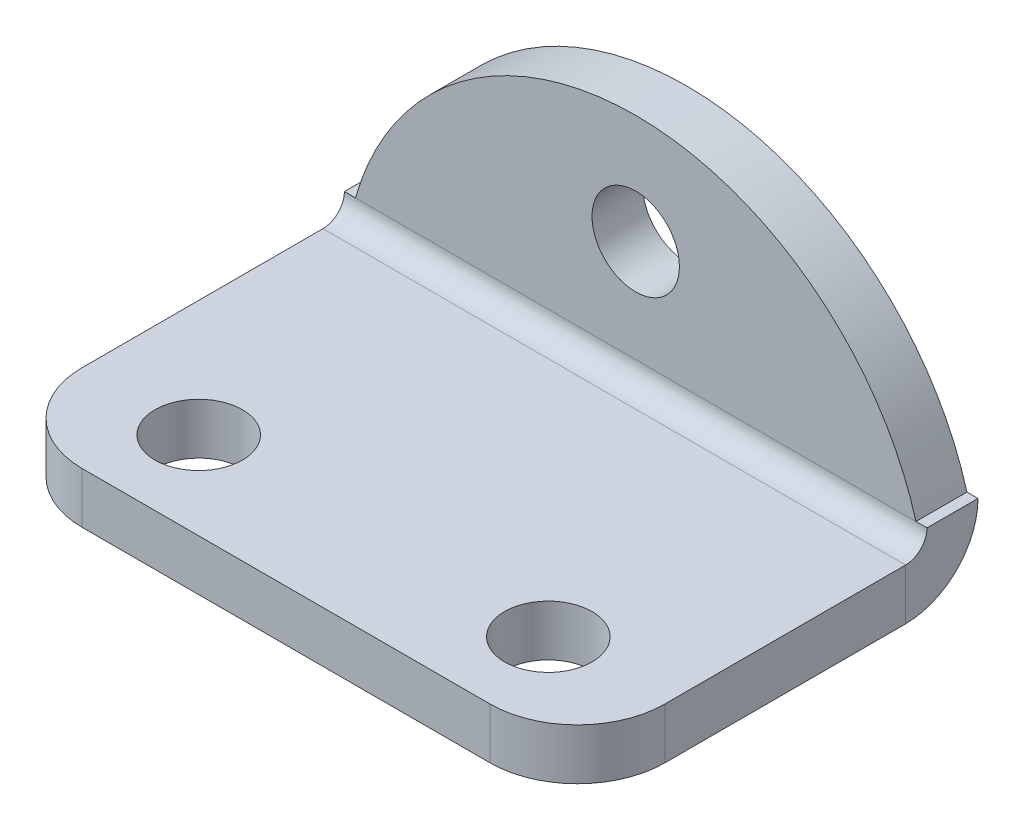
ISO-10303-21;
HEADER;
FILE_DESCRIPTION(('STEP AP214'),'2;1');
FILE_NAME('part.step','',(''),(''),'','','');
FILE_SCHEMA(('AUTOMOTIVE_DESIGN { 1 0 10303 214 1 1 1 1 }'));
ENDSEC;
DATA;
#1=APPLICATION_CONTEXT('core data for automotive mechanical design processes');
#2=APPLICATION_PROTOCOL_DEFINITION('international standard','automotive_design',2000,#1);
#3=PRODUCT_CONTEXT('',#1,'mechanical');
#4=PRODUCT('Part','Part','',(#3));
#5=PRODUCT_RELATED_PRODUCT_CATEGORY('part','',(#4));
#6=PRODUCT_DEFINITION_FORMATION('','',#4);
#7=PRODUCT_DEFINITION_CONTEXT('part definition',#1,'design');
#8=PRODUCT_DEFINITION('design','',#6,#7);
#9=PRODUCT_DEFINITION_SHAPE('','',#8);
#10=(LENGTH_UNIT() NAMED_UNIT(*) SI_UNIT(.MILLI.,.METRE.));
#11=(NAMED_UNIT(*) PLANE_ANGLE_UNIT() SI_UNIT($,.RADIAN.));
#12=(NAMED_UNIT(*) SI_UNIT($,.STERADIAN.) SOLID_ANGLE_UNIT());
#13=UNCERTAINTY_MEASURE_WITH_UNIT(LENGTH_MEASURE(1.E-05),#10,'distance_accuracy_value','');
#14=(GEOMETRIC_REPRESENTATION_CONTEXT(3) GLOBAL_UNCERTAINTY_ASSIGNED_CONTEXT((#13)) GLOBAL_UNIT_ASSIGNED_CONTEXT((#10,
#11,#12)) REPRESENTATION_CONTEXT('',''));
#15=CARTESIAN_POINT('',(0.,0.,0.));
#16=DIRECTION('',(0.,0.,1.));
#17=DIRECTION('',(1.,0.,0.));
#18=AXIS2_PLACEMENT_3D('',#15,#16,#17);
#19=CARTESIAN_POINT('',(8.88888888888889,0.106258373513657,-13.2365076242181));
#20=DIRECTION('',(0.,0.,1.));
#21=DIRECTION('',(1.,0.,0.));
#22=AXIS2_PLACEMENT_3D('',#19,#20,#21);
#23=PLANE('',#22);
#24=CARTESIAN_POINT('',(0.,3.88403615129143,-13.2365076242181));
#25=DIRECTION('',(0.,0.,-1.));
#26=DIRECTION('',(-1.,0.,0.));
#27=AXIS2_PLACEMENT_3D('',#24,#25,#26);
#28=CIRCLE('',#27,1.33333333333333);
#29=CARTESIAN_POINT('',(-1.33333333333333,3.88403615129143,-13.2365076242181));
#30=VERTEX_POINT('',#29);
#31=EDGE_CURVE('E300',#30,#30,#28,.T.);
#32=ORIENTED_EDGE('',*,*,#31,.F.);
#33=EDGE_LOOP('',(#32));
#34=FACE_BOUND('',#33,.T.);
#35=CARTESIAN_POINT('',(0.,-1.67436840711313,-13.2365076242181));
#36=DIRECTION('',(0.,0.,1.));
#37=DIRECTION('',(1.,0.,0.));
#38=AXIS2_PLACEMENT_3D('',#35,#36,#37);
#39=CIRCLE('',#38,8.89173789173789);
#40=CARTESIAN_POINT('',(8.55172003821328,0.761013929069212,-13.2365076242181));
#41=VERTEX_POINT('',#40);
#42=CARTESIAN_POINT('',(-8.55172003821328,0.761013929069212,-13.2365076242181));
#43=VERTEX_POINT('',#42);
#44=EDGE_CURVE('E305',#41,#43,#39,.T.);
#45=ORIENTED_EDGE('',*,*,#44,.F.);
#46=DIRECTION('',(-1.,0.,0.));
#47=VECTOR('',#46,1.);
#48=CARTESIAN_POINT('',(8.88888888888889,0.761013929069212,-13.2365076242181));
#49=LINE('',#48,#47);
#50=EDGE_CURVE('E262',#41,#43,#49,.T.);
#51=ORIENTED_EDGE('',*,*,#50,.T.);
#52=EDGE_LOOP('',(#45,#51));
#53=FACE_BOUND('',#52,.T.);
#54=ADVANCED_FACE('F71',(#34,#53),#23,.F.);
#55=CARTESIAN_POINT('',(8.88888888888889,0.106258373513657,-11.6809520686625));
#56=DIRECTION('',(0.,0.,1.));
#57=DIRECTION('',(1.,0.,0.));
#58=AXIS2_PLACEMENT_3D('',#55,#56,#57);
#59=PLANE('',#58);
#60=CARTESIAN_POINT('',(0.,3.88403615129143,-11.6809520686625));
#61=DIRECTION('',(0.,0.,1.));
#62=DIRECTION('',(1.,0.,0.));
#63=AXIS2_PLACEMENT_3D('',#60,#61,#62);
#64=CIRCLE('',#63,1.33333333333333);
#65=CARTESIAN_POINT('',(1.33333333333333,3.88403615129143,-11.6809520686625));
#66=VERTEX_POINT('',#65);
#67=EDGE_CURVE('E301',#66,#66,#64,.F.);
#68=ORIENTED_EDGE('',*,*,#67,.T.);
#69=EDGE_LOOP('',(#68));
#70=FACE_BOUND('',#69,.T.);
#71=DIRECTION('',(-1.,0.,0.));
#72=VECTOR('',#71,1.);
#73=CARTESIAN_POINT('',(8.88888888888889,0.761013929069212,-11.6809520686625));
#74=LINE('',#73,#72);
#75=CARTESIAN_POINT('',(8.55172003821328,0.761013929069212,-11.6809520686625));
#76=VERTEX_POINT('',#75);
#77=CARTESIAN_POINT('',(-8.55172003821328,0.761013929069212,-11.6809520686625));
#78=VERTEX_POINT('',#77);
#79=EDGE_CURVE('E176',#76,#78,#74,.T.);
#80=ORIENTED_EDGE('',*,*,#79,.F.);
#81=CARTESIAN_POINT('',(0.,-1.67436840711313,-11.6809520686625));
#82=DIRECTION('',(0.,0.,1.));
#83=DIRECTION('',(1.,0.,0.));
#84=AXIS2_PLACEMENT_3D('',#81,#82,#83);
#85=CIRCLE('',#84,8.89173789173789);
#86=EDGE_CURVE('E151',#78,#76,#85,.F.);
#87=ORIENTED_EDGE('',*,*,#86,.F.);
#88=EDGE_LOOP('',(#80,#87));
#89=FACE_BOUND('',#88,.T.);
#90=ADVANCED_FACE('F177',(#70,#89),#59,.T.);
#91=CARTESIAN_POINT('',(8.88888888888889,0.761013929069212,-11.6809520686625));
#92=DIRECTION('',(1.,0.,0.));
#93=DIRECTION('',(0.,0.,-1.));
#94=AXIS2_PLACEMENT_3D('',#91,#92,#93);
#95=PLANE('',#94);
#96=DIRECTION('',(0.,0.,-1.));
#97=VECTOR('',#96,1.);
#98=CARTESIAN_POINT('',(8.88888888888889,0.761013929069212,-11.6809520686625));
#99=LINE('',#98,#97);
#100=CARTESIAN_POINT('',(8.88888888888889,0.761013929069212,-11.6809520686625));
#101=VERTEX_POINT('',#100);
#102=CARTESIAN_POINT('',(8.88888888888889,0.761013929069212,-13.2365076242181));
#103=VERTEX_POINT('',#102);
#104=EDGE_CURVE('E204',#101,#103,#99,.T.);
#105=ORIENTED_EDGE('',*,*,#104,.F.);
#106=CARTESIAN_POINT('',(8.88888888888889,0.761013929069212,-11.026196513107));
#107=DIRECTION('',(-1.,0.,0.));
#108=DIRECTION('',(0.,0.,1.));
#109=AXIS2_PLACEMENT_3D('',#106,#107,#108);
#110=CIRCLE('',#109,0.654755555555556);
#111=CARTESIAN_POINT('',(8.88888888888889,0.106258373513657,-11.026196513107));
#112=VERTEX_POINT('',#111);
#113=EDGE_CURVE('E188',#112,#101,#110,.F.);
#114=ORIENTED_EDGE('',*,*,#113,.F.);
#115=DIRECTION('',(0.,1.,0.));
#116=VECTOR('',#115,1.);
#117=CARTESIAN_POINT('',(8.88888888888889,-1.4492971820419,-11.026196513107));
#118=LINE('',#117,#116);
#119=CARTESIAN_POINT('',(8.88888888888889,-1.4492971820419,-11.026196513107));
#120=VERTEX_POINT('',#119);
#121=EDGE_CURVE('E200',#120,#112,#118,.T.);
#122=ORIENTED_EDGE('',*,*,#121,.F.);
#123=CARTESIAN_POINT('',(8.88888888888889,0.761013929069212,-11.026196513107));
#124=DIRECTION('',(1.,0.,0.));
#125=DIRECTION('',(0.,0.,-1.));
#126=AXIS2_PLACEMENT_3D('',#123,#124,#125);
#127=CIRCLE('',#126,2.21031111111111);
#128=EDGE_CURVE('E273',#120,#103,#127,.T.);
#129=ORIENTED_EDGE('',*,*,#128,.T.);
#130=EDGE_LOOP('',(#105,#114,#122,#129));
#131=FACE_BOUND('',#130,.T.);
#132=ADVANCED_FACE('F331',(#131),#95,.T.);
#133=CARTESIAN_POINT('',(-8.88888888888889,0.106258373513657,-11.026196513107));
#134=DIRECTION('',(-1.,0.,0.));
#135=DIRECTION('',(0.,0.,1.));
#136=AXIS2_PLACEMENT_3D('',#133,#134,#135);
#137=PLANE('',#136);
#138=DIRECTION('',(0.,-1.,0.));
#139=VECTOR('',#138,1.);
#140=CARTESIAN_POINT('',(-8.88888888888889,0.106258373513657,-11.026196513107));
#141=LINE('',#140,#139);
#142=CARTESIAN_POINT('',(-8.88888888888889,0.106258373513657,-11.026196513107));
#143=VERTEX_POINT('',#142);
#144=CARTESIAN_POINT('',(-8.88888888888889,-1.4492971820419,-11.026196513107));
#145=VERTEX_POINT('',#144);
#146=EDGE_CURVE('E192',#143,#145,#141,.T.);
#147=ORIENTED_EDGE('',*,*,#146,.F.);
#148=CARTESIAN_POINT('',(-8.88888888888889,0.761013929069212,-11.026196513107));
#149=DIRECTION('',(-1.,0.,0.));
#150=DIRECTION('',(0.,0.,1.));
#151=AXIS2_PLACEMENT_3D('',#148,#149,#150);
#152=CIRCLE('',#151,0.654755555555556);
#153=CARTESIAN_POINT('',(-8.88888888888889,0.761013929069212,-11.6809520686625));
#154=VERTEX_POINT('',#153);
#155=EDGE_CURVE('E268',#143,#154,#152,.F.);
#156=ORIENTED_EDGE('',*,*,#155,.T.);
#157=DIRECTION('',(0.,0.,1.));
#158=VECTOR('',#157,1.);
#159=CARTESIAN_POINT('',(-8.88888888888889,0.761013929069212,-13.2365076242181));
#160=LINE('',#159,#158);
#161=CARTESIAN_POINT('',(-8.88888888888889,0.761013929069212,-13.2365076242181));
#162=VERTEX_POINT('',#161);
#163=EDGE_CURVE('E190',#162,#154,#160,.T.);
#164=ORIENTED_EDGE('',*,*,#163,.F.);
#165=CARTESIAN_POINT('',(-8.88888888888889,0.761013929069212,-11.026196513107));
#166=DIRECTION('',(1.,0.,0.));
#167=DIRECTION('',(0.,0.,-1.));
#168=AXIS2_PLACEMENT_3D('',#165,#166,#167);
#169=CIRCLE('',#168,2.21031111111111);
#170=EDGE_CURVE('E241',#145,#162,#169,.T.);
#171=ORIENTED_EDGE('',*,*,#170,.F.);
#172=EDGE_LOOP('',(#147,#156,#164,#171));
#173=FACE_BOUND('',#172,.T.);
#174=ADVANCED_FACE('F323',(#173),#137,.T.);
#175=CARTESIAN_POINT('',(-8.88888888888889,0.761013929069212,-13.2365076242181));
#176=DIRECTION('',(-1.,0.,0.));
#177=DIRECTION('',(0.,0.,1.));
#178=AXIS2_PLACEMENT_3D('',#175,#176,#177);
#179=PLANE('',#178);
#180=DIRECTION('',(0.,0.,-1.));
#181=VECTOR('',#180,1.);
#182=CARTESIAN_POINT('',(-8.88888888888889,-1.4492971820419,-1.01428540199586));
#183=LINE('',#182,#181);
#184=CARTESIAN_POINT('',(-8.88888888888889,-1.4492971820419,-3.68095206866253));
#185=VERTEX_POINT('',#184);
#186=EDGE_CURVE('E231',#185,#145,#183,.T.);
#187=ORIENTED_EDGE('',*,*,#186,.F.);
#188=DIRECTION('',(0.,1.,0.));
#189=VECTOR('',#188,1.);
#190=CARTESIAN_POINT('',(-8.88888888888889,0.761013929069212,-3.68095206866253));
#191=LINE('',#190,#189);
#192=CARTESIAN_POINT('',(-8.88888888888889,0.106258373513657,-3.68095206866253));
#193=VERTEX_POINT('',#192);
#194=EDGE_CURVE('E207',#185,#193,#191,.T.);
#195=ORIENTED_EDGE('',*,*,#194,.T.);
#196=DIRECTION('',(0.,0.,-1.));
#197=VECTOR('',#196,1.);
#198=CARTESIAN_POINT('',(-8.88888888888889,0.106258373513657,-1.01428540199586));
#199=LINE('',#198,#197);
#200=EDGE_CURVE('E242',#193,#143,#199,.T.);
#201=ORIENTED_EDGE('',*,*,#200,.T.);
#202=ORIENTED_EDGE('',*,*,#146,.T.);
#203=EDGE_LOOP('',(#187,#195,#201,#202));
#204=FACE_BOUND('',#203,.T.);
#205=ADVANCED_FACE('F236',(#204),#179,.T.);
#206=CARTESIAN_POINT('',(8.88888888888889,0.761013929069212,-11.026196513107));
#207=DIRECTION('',(-1.,0.,0.));
#208=DIRECTION('',(0.,0.,1.));
#209=AXIS2_PLACEMENT_3D('',#206,#207,#208);
#210=CYLINDRICAL_SURFACE('',#209,0.654755555555556);
#211=ORIENTED_EDGE('',*,*,#155,.F.);
#212=DIRECTION('',(-1.,0.,0.));
#213=VECTOR('',#212,1.);
#214=CARTESIAN_POINT('',(8.88888888888889,0.106258373513657,-11.026196513107));
#215=LINE('',#214,#213);
#216=EDGE_CURVE('E181',#112,#143,#215,.T.);
#217=ORIENTED_EDGE('',*,*,#216,.F.);
#218=ORIENTED_EDGE('',*,*,#113,.T.);
#219=EDGE_CURVE('E168',#101,#76,#74,.T.);
#220=ORIENTED_EDGE('',*,*,#219,.T.);
#221=ORIENTED_EDGE('',*,*,#79,.T.);
#222=DIRECTION('',(1.,0.,0.));
#223=VECTOR('',#222,1.);
#224=CARTESIAN_POINT('',(0.,0.761013929069212,-11.6809520686625));
#225=LINE('',#224,#223);
#226=EDGE_CURVE('E163',#154,#78,#225,.T.);
#227=ORIENTED_EDGE('',*,*,#226,.F.);
#228=EDGE_LOOP('',(#211,#217,#218,#220,#221,#227));
#229=FACE_BOUND('',#228,.T.);
#230=ADVANCED_FACE('F185',(#229),#210,.F.);
#231=CARTESIAN_POINT('',(8.88888888888889,0.106258373513657,-1.01428540199586));
#232=DIRECTION('',(0.,1.,0.));
#233=DIRECTION('',(0.,0.,1.));
#234=AXIS2_PLACEMENT_3D('',#231,#232,#233);
#235=PLANE('',#234);
#236=CARTESIAN_POINT('',(5.33333333333333,0.106258373513657,-3.68095206866253));
#237=DIRECTION('',(0.,1.,0.));
#238=DIRECTION('',(0.,0.,1.));
#239=AXIS2_PLACEMENT_3D('',#236,#237,#238);
#240=CIRCLE('',#239,1.33333333333333);
#241=CARTESIAN_POINT('',(5.33333333333333,0.106258373513657,-2.3476187353292));
#242=VERTEX_POINT('',#241);
#243=EDGE_CURVE('E296',#242,#242,#240,.T.);
#244=ORIENTED_EDGE('',*,*,#243,.F.);
#245=EDGE_LOOP('',(#244));
#246=FACE_BOUND('',#245,.T.);
#247=CARTESIAN_POINT('',(-5.33333333333333,0.106258373513657,-3.68095206866253));
#248=DIRECTION('',(0.,1.,0.));
#249=DIRECTION('',(0.,0.,1.));
#250=AXIS2_PLACEMENT_3D('',#247,#248,#249);
#251=CIRCLE('',#250,1.33333333333333);
#252=CARTESIAN_POINT('',(-5.33333333333333,0.106258373513657,-2.3476187353292));
#253=VERTEX_POINT('',#252);
#254=EDGE_CURVE('E288',#253,#253,#251,.T.);
#255=ORIENTED_EDGE('',*,*,#254,.F.);
#256=EDGE_LOOP('',(#255));
#257=FACE_BOUND('',#256,.T.);
#258=ORIENTED_EDGE('',*,*,#200,.F.);
#259=CARTESIAN_POINT('',(-6.22222222222222,0.106258373513657,-3.68095206866253));
#260=DIRECTION('',(0.,1.,0.));
#261=DIRECTION('',(0.,0.,1.));
#262=AXIS2_PLACEMENT_3D('',#259,#260,#261);
#263=CIRCLE('',#262,2.66666666666667);
#264=CARTESIAN_POINT('',(-6.22222222222222,0.106258373513657,-1.01428540199586));
#265=VERTEX_POINT('',#264);
#266=EDGE_CURVE('E214',#193,#265,#263,.T.);
#267=ORIENTED_EDGE('',*,*,#266,.T.);
#268=DIRECTION('',(-1.,0.,0.));
#269=VECTOR('',#268,1.);
#270=CARTESIAN_POINT('',(8.88888888888889,0.106258373513657,-1.01428540199586));
#271=LINE('',#270,#269);
#272=CARTESIAN_POINT('',(6.22222222222222,0.106258373513657,-1.01428540199586));
#273=VERTEX_POINT('',#272);
#274=EDGE_CURVE('E248',#273,#265,#271,.T.);
#275=ORIENTED_EDGE('',*,*,#274,.F.);
#276=CARTESIAN_POINT('',(6.22222222222222,0.106258373513657,-3.68095206866253));
#277=DIRECTION('',(0.,1.,0.));
#278=DIRECTION('',(0.,0.,1.));
#279=AXIS2_PLACEMENT_3D('',#276,#277,#278);
#280=CIRCLE('',#279,2.66666666666667);
#281=CARTESIAN_POINT('',(8.88888888888889,0.106258373513657,-3.68095206866253));
#282=VERTEX_POINT('',#281);
#283=EDGE_CURVE('E211',#273,#282,#280,.T.);
#284=ORIENTED_EDGE('',*,*,#283,.T.);
#285=DIRECTION('',(0.,0.,-1.));
#286=VECTOR('',#285,1.);
#287=CARTESIAN_POINT('',(8.88888888888889,0.106258373513657,-1.01428540199586));
#288=LINE('',#287,#286);
#289=EDGE_CURVE('E280',#282,#112,#288,.T.);
#290=ORIENTED_EDGE('',*,*,#289,.T.);
#291=ORIENTED_EDGE('',*,*,#216,.T.);
#292=EDGE_LOOP('',(#258,#267,#275,#284,#290,#291));
#293=FACE_BOUND('',#292,.T.);
#294=ADVANCED_FACE('F247',(#246,#257,#293),#235,.T.);
#295=CARTESIAN_POINT('',(8.88888888888889,-1.4492971820419,-1.01428540199586));
#296=DIRECTION('',(0.,0.,1.));
#297=DIRECTION('',(1.,0.,0.));
#298=AXIS2_PLACEMENT_3D('',#295,#296,#297);
#299=PLANE('',#298);
#300=ORIENTED_EDGE('',*,*,#274,.T.);
#301=DIRECTION('',(0.,1.,0.));
#302=VECTOR('',#301,1.);
#303=CARTESIAN_POINT('',(-6.22222222222222,-1.4492971820419,-1.01428540199586));
#304=LINE('',#303,#302);
#305=CARTESIAN_POINT('',(-6.22222222222222,-1.4492971820419,-1.01428540199586));
#306=VERTEX_POINT('',#305);
#307=EDGE_CURVE('E93',#265,#306,#304,.F.);
#308=ORIENTED_EDGE('',*,*,#307,.T.);
#309=DIRECTION('',(-1.,0.,0.));
#310=VECTOR('',#309,1.);
#311=CARTESIAN_POINT('',(8.88888888888889,-1.4492971820419,-1.01428540199586));
#312=LINE('',#311,#310);
#313=CARTESIAN_POINT('',(6.22222222222222,-1.4492971820419,-1.01428540199586));
#314=VERTEX_POINT('',#313);
#315=EDGE_CURVE('E232',#314,#306,#312,.T.);
#316=ORIENTED_EDGE('',*,*,#315,.F.);
#317=DIRECTION('',(0.,1.,0.));
#318=VECTOR('',#317,1.);
#319=CARTESIAN_POINT('',(6.22222222222222,0.106258373513657,-1.01428540199586));
#320=LINE('',#319,#318);
#321=EDGE_CURVE('E217',#314,#273,#320,.T.);
#322=ORIENTED_EDGE('',*,*,#321,.T.);
#323=EDGE_LOOP('',(#300,#308,#316,#322));
#324=FACE_BOUND('',#323,.T.);
#325=ADVANCED_FACE('F250',(#324),#299,.T.);
#326=CARTESIAN_POINT('',(8.88888888888889,-1.4492971820419,-1.01428540199586));
#327=DIRECTION('',(0.,1.,0.));
#328=DIRECTION('',(0.,0.,1.));
#329=AXIS2_PLACEMENT_3D('',#326,#327,#328);
#330=PLANE('',#329);
#331=CARTESIAN_POINT('',(5.33333333333333,-1.4492971820419,-3.68095206866253));
#332=DIRECTION('',(0.,1.,0.));
#333=DIRECTION('',(0.,0.,1.));
#334=AXIS2_PLACEMENT_3D('',#331,#332,#333);
#335=CIRCLE('',#334,1.33333333333333);
#336=CARTESIAN_POINT('',(5.33333333333333,-1.4492971820419,-2.3476187353292));
#337=VERTEX_POINT('',#336);
#338=EDGE_CURVE('E292',#337,#337,#335,.F.);
#339=ORIENTED_EDGE('',*,*,#338,.F.);
#340=EDGE_LOOP('',(#339));
#341=FACE_BOUND('',#340,.T.);
#342=CARTESIAN_POINT('',(-5.33333333333333,-1.4492971820419,-3.68095206866253));
#343=DIRECTION('',(0.,1.,0.));
#344=DIRECTION('',(0.,0.,1.));
#345=AXIS2_PLACEMENT_3D('',#342,#343,#344);
#346=CIRCLE('',#345,1.33333333333333);
#347=CARTESIAN_POINT('',(-5.33333333333333,-1.4492971820419,-2.3476187353292));
#348=VERTEX_POINT('',#347);
#349=EDGE_CURVE('E272',#348,#348,#346,.F.);
#350=ORIENTED_EDGE('',*,*,#349,.F.);
#351=EDGE_LOOP('',(#350));
#352=FACE_BOUND('',#351,.T.);
#353=ORIENTED_EDGE('',*,*,#315,.T.);
#354=CARTESIAN_POINT('',(-6.22222222222222,-1.4492971820419,-3.68095206866253));
#355=DIRECTION('',(0.,1.,0.));
#356=DIRECTION('',(0.,0.,1.));
#357=AXIS2_PLACEMENT_3D('',#354,#355,#356);
#358=CIRCLE('',#357,2.66666666666667);
#359=EDGE_CURVE('E80',#306,#185,#358,.F.);
#360=ORIENTED_EDGE('',*,*,#359,.T.);
#361=ORIENTED_EDGE('',*,*,#186,.T.);
#362=DIRECTION('',(-1.,0.,0.));
#363=VECTOR('',#362,1.);
#364=CARTESIAN_POINT('',(8.88888888888889,-1.4492971820419,-11.026196513107));
#365=LINE('',#364,#363);
#366=EDGE_CURVE('E255',#120,#145,#365,.T.);
#367=ORIENTED_EDGE('',*,*,#366,.F.);
#368=DIRECTION('',(0.,0.,-1.));
#369=VECTOR('',#368,1.);
#370=CARTESIAN_POINT('',(8.88888888888889,-1.4492971820419,-1.01428540199586));
#371=LINE('',#370,#369);
#372=CARTESIAN_POINT('',(8.88888888888889,-1.4492971820419,-3.68095206866253));
#373=VERTEX_POINT('',#372);
#374=EDGE_CURVE('E277',#373,#120,#371,.T.);
#375=ORIENTED_EDGE('',*,*,#374,.F.);
#376=CARTESIAN_POINT('',(6.22222222222222,-1.4492971820419,-3.68095206866253));
#377=DIRECTION('',(0.,1.,0.));
#378=DIRECTION('',(0.,0.,1.));
#379=AXIS2_PLACEMENT_3D('',#376,#377,#378);
#380=CIRCLE('',#379,2.66666666666667);
#381=EDGE_CURVE('E223',#373,#314,#380,.F.);
#382=ORIENTED_EDGE('',*,*,#381,.T.);
#383=EDGE_LOOP('',(#353,#360,#361,#367,#375,#382));
#384=FACE_BOUND('',#383,.T.);
#385=ADVANCED_FACE('F229',(#341,#352,#384),#330,.F.);
#386=CARTESIAN_POINT('',(8.88888888888889,0.761013929069212,-11.026196513107));
#387=DIRECTION('',(-1.,0.,0.));
#388=DIRECTION('',(0.,0.,1.));
#389=AXIS2_PLACEMENT_3D('',#386,#387,#388);
#390=CYLINDRICAL_SURFACE('',#389,2.21031111111111);
#391=ORIENTED_EDGE('',*,*,#170,.T.);
#392=DIRECTION('',(-1.,0.,0.));
#393=VECTOR('',#392,1.);
#394=CARTESIAN_POINT('',(8.88888888888889,0.761013929069212,-13.2365076242181));
#395=LINE('',#394,#393);
#396=EDGE_CURVE('E174',#43,#162,#395,.T.);
#397=ORIENTED_EDGE('',*,*,#396,.F.);
#398=ORIENTED_EDGE('',*,*,#50,.F.);
#399=EDGE_CURVE('E171',#103,#41,#49,.T.);
#400=ORIENTED_EDGE('',*,*,#399,.F.);
#401=ORIENTED_EDGE('',*,*,#128,.F.);
#402=ORIENTED_EDGE('',*,*,#366,.T.);
#403=EDGE_LOOP('',(#391,#397,#398,#400,#401,#402));
#404=FACE_BOUND('',#403,.T.);
#405=ADVANCED_FACE('F324',(#404),#390,.T.);
#406=CARTESIAN_POINT('',(8.88888888888889,0.761013929069212,-11.026196513107));
#407=DIRECTION('',(-1.,0.,0.));
#408=DIRECTION('',(0.,0.,1.));
#409=AXIS2_PLACEMENT_3D('',#406,#407,#408);
#410=PLANE('',#409);
#411=ORIENTED_EDGE('',*,*,#289,.F.);
#412=DIRECTION('',(0.,1.,0.));
#413=VECTOR('',#412,1.);
#414=CARTESIAN_POINT('',(8.88888888888889,-1.4492971820419,-3.68095206866253));
#415=LINE('',#414,#413);
#416=EDGE_CURVE('E12',#282,#373,#415,.F.);
#417=ORIENTED_EDGE('',*,*,#416,.T.);
#418=ORIENTED_EDGE('',*,*,#374,.T.);
#419=ORIENTED_EDGE('',*,*,#121,.T.);
#420=EDGE_LOOP('',(#411,#417,#418,#419));
#421=FACE_BOUND('',#420,.T.);
#422=ADVANCED_FACE('F329',(#421),#410,.F.);
#423=CARTESIAN_POINT('',(-6.22222222222222,0.761013929069212,-3.68095206866253));
#424=DIRECTION('',(0.,1.,0.));
#425=DIRECTION('',(0.,0.,1.));
#426=AXIS2_PLACEMENT_3D('',#423,#424,#425);
#427=CYLINDRICAL_SURFACE('',#426,2.66666666666667);
#428=ORIENTED_EDGE('',*,*,#359,.F.);
#429=ORIENTED_EDGE('',*,*,#307,.F.);
#430=ORIENTED_EDGE('',*,*,#266,.F.);
#431=ORIENTED_EDGE('',*,*,#194,.F.);
#432=EDGE_LOOP('',(#428,#429,#430,#431));
#433=FACE_BOUND('',#432,.T.);
#434=ADVANCED_FACE('F244',(#433),#427,.T.);
#435=CARTESIAN_POINT('',(6.22222222222222,-1.4492971820419,-3.68095206866253));
#436=DIRECTION('',(0.,-1.,0.));
#437=DIRECTION('',(0.,0.,-1.));
#438=AXIS2_PLACEMENT_3D('',#435,#436,#437);
#439=CYLINDRICAL_SURFACE('',#438,2.66666666666667);
#440=ORIENTED_EDGE('',*,*,#381,.F.);
#441=ORIENTED_EDGE('',*,*,#416,.F.);
#442=ORIENTED_EDGE('',*,*,#283,.F.);
#443=ORIENTED_EDGE('',*,*,#321,.F.);
#444=EDGE_LOOP('',(#440,#441,#442,#443));
#445=FACE_BOUND('',#444,.T.);
#446=ADVANCED_FACE('F73',(#445),#439,.T.);
#447=CARTESIAN_POINT('',(-5.33333333333333,-1.45018607093079,-3.68095206866253));
#448=DIRECTION('',(0.,1.,0.));
#449=DIRECTION('',(0.,0.,1.));
#450=AXIS2_PLACEMENT_3D('',#447,#448,#449);
#451=CYLINDRICAL_SURFACE('',#450,1.33333333333333);
#452=ORIENTED_EDGE('',*,*,#254,.T.);
#453=EDGE_LOOP('',(#452));
#454=FACE_BOUND('',#453,.T.);
#455=ORIENTED_EDGE('',*,*,#349,.T.);
#456=EDGE_LOOP('',(#455));
#457=FACE_BOUND('',#456,.T.);
#458=ADVANCED_FACE('F355',(#454,#457),#451,.F.);
#459=CARTESIAN_POINT('',(5.33333333333333,-1.45018607093079,-3.68095206866253));
#460=DIRECTION('',(0.,1.,0.));
#461=DIRECTION('',(0.,0.,1.));
#462=AXIS2_PLACEMENT_3D('',#459,#460,#461);
#463=CYLINDRICAL_SURFACE('',#462,1.33333333333333);
#464=ORIENTED_EDGE('',*,*,#243,.T.);
#465=EDGE_LOOP('',(#464));
#466=FACE_BOUND('',#465,.T.);
#467=ORIENTED_EDGE('',*,*,#338,.T.);
#468=EDGE_LOOP('',(#467));
#469=FACE_BOUND('',#468,.T.);
#470=ADVANCED_FACE('F449',(#466,#469),#463,.F.);
#471=CARTESIAN_POINT('',(0.,3.88403615129143,-1.01339651310698));
#472=DIRECTION('',(0.,0.,-1.));
#473=DIRECTION('',(-1.,0.,0.));
#474=AXIS2_PLACEMENT_3D('',#471,#472,#473);
#475=CYLINDRICAL_SURFACE('',#474,1.33333333333333);
#476=ORIENTED_EDGE('',*,*,#67,.F.);
#477=EDGE_LOOP('',(#476));
#478=FACE_BOUND('',#477,.T.);
#479=ORIENTED_EDGE('',*,*,#31,.T.);
#480=EDGE_LOOP('',(#479));
#481=FACE_BOUND('',#480,.T.);
#482=ADVANCED_FACE('F404',(#478,#481),#475,.F.);
#483=CARTESIAN_POINT('',(0.,0.761013929069212,-13.2375076242181));
#484=DIRECTION('',(0.,-1.,0.));
#485=DIRECTION('',(0.,0.,-1.));
#486=AXIS2_PLACEMENT_3D('',#483,#484,#485);
#487=PLANE('',#486);
#488=ORIENTED_EDGE('',*,*,#396,.T.);
#489=ORIENTED_EDGE('',*,*,#163,.T.);
#490=ORIENTED_EDGE('',*,*,#226,.T.);
#491=DIRECTION('',(0.,0.,1.));
#492=VECTOR('',#491,1.);
#493=CARTESIAN_POINT('',(-8.55172003821328,0.761013929069212,-13.2375076242181));
#494=LINE('',#493,#492);
#495=EDGE_CURVE('E158',#43,#78,#494,.T.);
#496=ORIENTED_EDGE('',*,*,#495,.F.);
#497=EDGE_LOOP('',(#488,#489,#490,#496));
#498=FACE_BOUND('',#497,.T.);
#499=ADVANCED_FACE('F319',(#498),#487,.F.);
#500=CARTESIAN_POINT('',(0.,-1.67436840711313,-13.2375076242181));
#501=DIRECTION('',(0.,0.,1.));
#502=DIRECTION('',(1.,0.,0.));
#503=AXIS2_PLACEMENT_3D('',#500,#501,#502);
#504=CYLINDRICAL_SURFACE('',#503,8.89173789173789);
#505=ORIENTED_EDGE('',*,*,#44,.T.);
#506=ORIENTED_EDGE('',*,*,#495,.T.);
#507=ORIENTED_EDGE('',*,*,#86,.T.);
#508=DIRECTION('',(0.,0.,1.));
#509=VECTOR('',#508,1.);
#510=CARTESIAN_POINT('',(8.55172003821328,0.761013929069212,-13.2375076242181));
#511=LINE('',#510,#509);
#512=EDGE_CURVE('E155',#41,#76,#511,.T.);
#513=ORIENTED_EDGE('',*,*,#512,.F.);
#514=EDGE_LOOP('',(#505,#506,#507,#513));
#515=FACE_BOUND('',#514,.T.);
#516=ADVANCED_FACE('F154',(#515),#504,.T.);
#517=CARTESIAN_POINT('',(0.,0.761013929069212,-13.2375076242181));
#518=DIRECTION('',(0.,-1.,0.));
#519=DIRECTION('',(0.,0.,-1.));
#520=AXIS2_PLACEMENT_3D('',#517,#518,#519);
#521=PLANE('',#520);
#522=ORIENTED_EDGE('',*,*,#399,.T.);
#523=ORIENTED_EDGE('',*,*,#512,.T.);
#524=ORIENTED_EDGE('',*,*,#219,.F.);
#525=ORIENTED_EDGE('',*,*,#104,.T.);
#526=EDGE_LOOP('',(#522,#523,#524,#525));
#527=FACE_BOUND('',#526,.T.);
#528=ADVANCED_FACE('F166',(#527),#521,.F.);
#529=CLOSED_SHELL('',(#54,#90,#132,#174,#205,#230,#294,#325,#385,#405,#422,#434,#446,#458,#470,
#482,#499,#516,#528));
#530=MANIFOLD_SOLID_BREP('B2',#529);
#531=ADVANCED_BREP_SHAPE_REPRESENTATION('',(#18,#530),#14);
#532=SHAPE_DEFINITION_REPRESENTATION(#9,#531);
ENDSEC;
END-ISO-10303-21;
